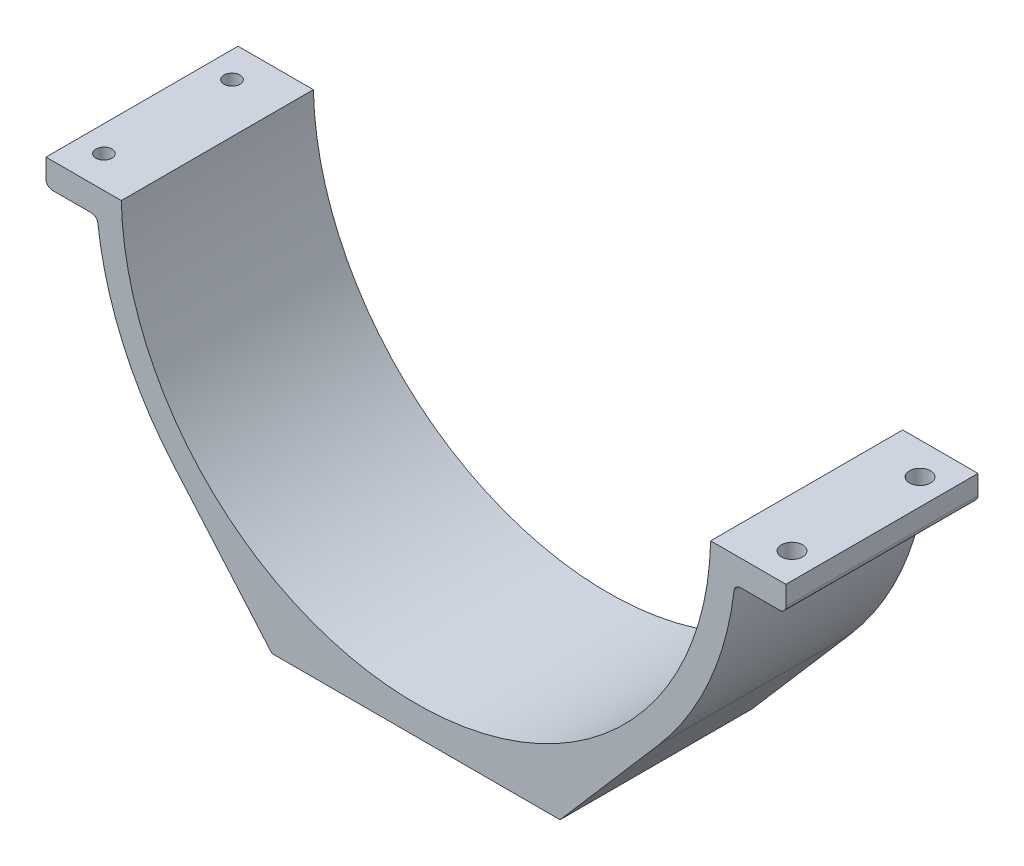
ISO-10303-21;
HEADER;
FILE_DESCRIPTION(('STEP AP214'),'2;1');
FILE_NAME('part.step','',(''),(''),'','','');
FILE_SCHEMA(('AUTOMOTIVE_DESIGN { 1 0 10303 214 1 1 1 1 }'));
ENDSEC;
DATA;
#1=APPLICATION_CONTEXT('core data for automotive mechanical design processes');
#2=APPLICATION_PROTOCOL_DEFINITION('international standard','automotive_design',2000,#1);
#3=PRODUCT_CONTEXT('',#1,'mechanical');
#4=PRODUCT('Part','Part','',(#3));
#5=PRODUCT_RELATED_PRODUCT_CATEGORY('part','',(#4));
#6=PRODUCT_DEFINITION_FORMATION('','',#4);
#7=PRODUCT_DEFINITION_CONTEXT('part definition',#1,'design');
#8=PRODUCT_DEFINITION('design','',#6,#7);
#9=PRODUCT_DEFINITION_SHAPE('','',#8);
#10=(LENGTH_UNIT() NAMED_UNIT(*) SI_UNIT(.MILLI.,.METRE.));
#11=(NAMED_UNIT(*) PLANE_ANGLE_UNIT() SI_UNIT($,.RADIAN.));
#12=(NAMED_UNIT(*) SI_UNIT($,.STERADIAN.) SOLID_ANGLE_UNIT());
#13=UNCERTAINTY_MEASURE_WITH_UNIT(LENGTH_MEASURE(1.E-05),#10,'distance_accuracy_value','');
#14=(GEOMETRIC_REPRESENTATION_CONTEXT(3) GLOBAL_UNCERTAINTY_ASSIGNED_CONTEXT((#13)) GLOBAL_UNIT_ASSIGNED_CONTEXT((#10,
#11,#12)) REPRESENTATION_CONTEXT('',''));
#15=CARTESIAN_POINT('',(0.,0.,0.));
#16=DIRECTION('',(0.,0.,1.));
#17=DIRECTION('',(1.,0.,0.));
#18=AXIS2_PLACEMENT_3D('',#15,#16,#17);
#19=CARTESIAN_POINT('',(-20.,-42.0085799785623,4.99999999999999));
#20=DIRECTION('',(0.,-1.,0.));
#21=DIRECTION('',(0.,0.,-1.));
#22=AXIS2_PLACEMENT_3D('',#19,#20,#21);
#23=CONICAL_SURFACE('',#22,0.,1.02974425867664);
#24=CARTESIAN_POINT('',(-20.,-42.9999999999578,4.99999999999999));
#25=DIRECTION('',(0.,1.,0.));
#26=DIRECTION('',(0.,0.,1.));
#27=AXIS2_PLACEMENT_3D('',#24,#25,#26);
#28=CIRCLE('',#27,1.65);
#29=CARTESIAN_POINT('',(-20.,-42.9999999999578,6.64999999999999));
#30=VERTEX_POINT('',#29);
#31=EDGE_CURVE('E251',#30,#30,#28,.T.);
#32=ORIENTED_EDGE('',*,*,#31,.F.);
#33=EDGE_LOOP('',(#32));
#34=FACE_BOUND('',#33,.T.);
#35=CARTESIAN_POINT('',(-20.,-42.0085799785623,4.99999999999999));
#36=VERTEX_POINT('',#35);
#37=VERTEX_LOOP('',#36);
#38=FACE_BOUND('',#37,.T.);
#39=ADVANCED_FACE('F17',(#34,#38),#23,.F.);
#40=CARTESIAN_POINT('',(20.,-42.0085799785623,4.99999999999999));
#41=DIRECTION('',(0.,-1.,0.));
#42=DIRECTION('',(0.,0.,-1.));
#43=AXIS2_PLACEMENT_3D('',#40,#41,#42);
#44=CONICAL_SURFACE('',#43,0.,1.02974425867664);
#45=CARTESIAN_POINT('',(20.,-42.9999999999578,4.99999999999999));
#46=DIRECTION('',(0.,1.,0.));
#47=DIRECTION('',(0.,0.,1.));
#48=AXIS2_PLACEMENT_3D('',#45,#46,#47);
#49=CIRCLE('',#48,1.65);
#50=CARTESIAN_POINT('',(20.,-42.9999999999578,6.64999999999999));
#51=VERTEX_POINT('',#50);
#52=EDGE_CURVE('E338',#51,#51,#49,.T.);
#53=ORIENTED_EDGE('',*,*,#52,.F.);
#54=EDGE_LOOP('',(#53));
#55=FACE_BOUND('',#54,.T.);
#56=CARTESIAN_POINT('',(20.,-42.0085799785623,4.99999999999999));
#57=VERTEX_POINT('',#56);
#58=VERTEX_LOOP('',#57);
#59=FACE_BOUND('',#58,.T.);
#60=ADVANCED_FACE('F135',(#55,#59),#44,.F.);
#61=CARTESIAN_POINT('',(-20.0000000000051,-42.0085799785623,25.));
#62=DIRECTION('',(0.,-1.,0.));
#63=DIRECTION('',(0.,0.,-1.));
#64=AXIS2_PLACEMENT_3D('',#61,#62,#63);
#65=CONICAL_SURFACE('',#64,0.,1.02974425867666);
#66=CARTESIAN_POINT('',(-20.0000000000051,-42.9999999999578,25.));
#67=DIRECTION('',(0.,1.,0.));
#68=DIRECTION('',(0.,0.,1.));
#69=AXIS2_PLACEMENT_3D('',#66,#67,#68);
#70=CIRCLE('',#69,1.65000000000004);
#71=CARTESIAN_POINT('',(-20.0000000000051,-42.9999999999578,26.65));
#72=VERTEX_POINT('',#71);
#73=EDGE_CURVE('E333',#72,#72,#70,.T.);
#74=ORIENTED_EDGE('',*,*,#73,.F.);
#75=EDGE_LOOP('',(#74));
#76=FACE_BOUND('',#75,.T.);
#77=CARTESIAN_POINT('',(-20.0000000000051,-42.0085799785623,25.));
#78=VERTEX_POINT('',#77);
#79=VERTEX_LOOP('',#78);
#80=FACE_BOUND('',#79,.T.);
#81=ADVANCED_FACE('F142',(#76,#80),#65,.F.);
#82=CARTESIAN_POINT('',(20.0000000000051,-42.0085799785623,25.));
#83=DIRECTION('',(0.,-1.,0.));
#84=DIRECTION('',(0.,0.,-1.));
#85=AXIS2_PLACEMENT_3D('',#82,#83,#84);
#86=CONICAL_SURFACE('',#85,0.,1.02974425867666);
#87=CARTESIAN_POINT('',(20.0000000000051,-42.9999999999578,25.));
#88=DIRECTION('',(0.,1.,0.));
#89=DIRECTION('',(0.,0.,1.));
#90=AXIS2_PLACEMENT_3D('',#87,#88,#89);
#91=CIRCLE('',#90,1.65000000000004);
#92=CARTESIAN_POINT('',(20.0000000000051,-42.9999999999578,26.65));
#93=VERTEX_POINT('',#92);
#94=EDGE_CURVE('E328',#93,#93,#91,.T.);
#95=ORIENTED_EDGE('',*,*,#94,.F.);
#96=EDGE_LOOP('',(#95));
#97=FACE_BOUND('',#96,.T.);
#98=CARTESIAN_POINT('',(20.0000000000051,-42.0085799785623,25.));
#99=VERTEX_POINT('',#98);
#100=VERTEX_LOOP('',#99);
#101=FACE_BOUND('',#100,.T.);
#102=ADVANCED_FACE('F632',(#97,#101),#86,.F.);
#103=CARTESIAN_POINT('',(-56.7870606307502,-4.,0.));
#104=DIRECTION('',(0.,0.,1.));
#105=DIRECTION('',(1.,0.,0.));
#106=AXIS2_PLACEMENT_3D('',#103,#104,#105);
#107=CYLINDRICAL_SURFACE('',#106,1.00000000000003);
#108=CARTESIAN_POINT('',(-56.7870606307502,-4.,29.9999999999999));
#109=DIRECTION('',(0.,0.,1.));
#110=DIRECTION('',(1.,0.,0.));
#111=AXIS2_PLACEMENT_3D('',#108,#109,#110);
#112=CIRCLE('',#111,1.00000000000003);
#113=CARTESIAN_POINT('',(-56.7870606307502,-4.99999999999999,29.9999999999999));
#114=VERTEX_POINT('',#113);
#115=CARTESIAN_POINT('',(-57.7870606307502,-4.,29.9999999999999));
#116=VERTEX_POINT('',#115);
#117=EDGE_CURVE('E253',#114,#116,#112,.F.);
#118=ORIENTED_EDGE('',*,*,#117,.T.);
#119=DIRECTION('',(0.,0.,1.));
#120=VECTOR('',#119,1.);
#121=CARTESIAN_POINT('',(-57.7870606307502,-4.,14.9999999999999));
#122=LINE('',#121,#120);
#123=CARTESIAN_POINT('',(-57.7870606307502,-4.,0.));
#124=VERTEX_POINT('',#123);
#125=EDGE_CURVE('E261',#124,#116,#122,.T.);
#126=ORIENTED_EDGE('',*,*,#125,.F.);
#127=CARTESIAN_POINT('',(-56.7870606307502,-4.,0.));
#128=DIRECTION('',(0.,0.,1.));
#129=DIRECTION('',(1.,0.,0.));
#130=AXIS2_PLACEMENT_3D('',#127,#128,#129);
#131=CIRCLE('',#130,1.00000000000003);
#132=CARTESIAN_POINT('',(-56.7870606307502,-4.99999999999999,0.));
#133=VERTEX_POINT('',#132);
#134=EDGE_CURVE('E21',#124,#133,#131,.T.);
#135=ORIENTED_EDGE('',*,*,#134,.T.);
#136=DIRECTION('',(0.,0.,-1.));
#137=VECTOR('',#136,1.);
#138=CARTESIAN_POINT('',(-56.7870606307502,-4.99999999999999,14.9999999999999));
#139=LINE('',#138,#137);
#140=EDGE_CURVE('E248',#114,#133,#139,.T.);
#141=ORIENTED_EDGE('',*,*,#140,.F.);
#142=EDGE_LOOP('',(#118,#126,#135,#141));
#143=FACE_BOUND('',#142,.T.);
#144=ADVANCED_FACE('F259',(#143),#107,.T.);
#145=CARTESIAN_POINT('',(-50.6835910946532,-6.00000000000004,29.9999999999999));
#146=DIRECTION('',(0.,0.,-1.));
#147=DIRECTION('',(0.,1.,0.));
#148=AXIS2_PLACEMENT_3D('',#145,#146,#147);
#149=CYLINDRICAL_SURFACE('',#148,1.00000000000008);
#150=CARTESIAN_POINT('',(-50.6835910946532,-6.00000000000004,29.9999999999999));
#151=DIRECTION('',(0.,0.,-1.));
#152=DIRECTION('',(0.,1.,0.));
#153=AXIS2_PLACEMENT_3D('',#150,#151,#152);
#154=CIRCLE('',#153,1.00000000000008);
#155=CARTESIAN_POINT('',(-49.6905253862102,-5.88243938280679,29.9999999999999));
#156=VERTEX_POINT('',#155);
#157=CARTESIAN_POINT('',(-50.6835910946532,-4.99999999999999,29.9999999999999));
#158=VERTEX_POINT('',#157);
#159=EDGE_CURVE('E249',#156,#158,#154,.F.);
#160=ORIENTED_EDGE('',*,*,#159,.T.);
#161=DIRECTION('',(0.,0.,1.));
#162=VECTOR('',#161,1.);
#163=CARTESIAN_POINT('',(-50.6835910946532,-4.99999999999999,14.9999999999999));
#164=LINE('',#163,#162);
#165=CARTESIAN_POINT('',(-50.6835910946532,-4.99999999999999,0.));
#166=VERTEX_POINT('',#165);
#167=EDGE_CURVE('E271',#166,#158,#164,.T.);
#168=ORIENTED_EDGE('',*,*,#167,.F.);
#169=CARTESIAN_POINT('',(-50.6835910946533,-6.00000000000017,0.));
#170=DIRECTION('',(0.,0.,-1.));
#171=DIRECTION('',(0.,1.,0.));
#172=AXIS2_PLACEMENT_3D('',#169,#170,#171);
#173=CIRCLE('',#172,1.00000000000008);
#174=CARTESIAN_POINT('',(-49.6905253862103,-5.88243938280685,0.));
#175=VERTEX_POINT('',#174);
#176=EDGE_CURVE('E252',#166,#175,#173,.T.);
#177=ORIENTED_EDGE('',*,*,#176,.T.);
#178=DIRECTION('',(0.,0.,-1.));
#179=VECTOR('',#178,1.);
#180=CARTESIAN_POINT('',(-49.6905253862102,-5.88243938280677,14.9999999999999));
#181=LINE('',#180,#179);
#182=EDGE_CURVE('E244',#156,#175,#181,.T.);
#183=ORIENTED_EDGE('',*,*,#182,.F.);
#184=EDGE_LOOP('',(#160,#168,#177,#183));
#185=FACE_BOUND('',#184,.T.);
#186=ADVANCED_FACE('F351',(#185),#149,.F.);
#187=CARTESIAN_POINT('',(-20.,-42.9999999999578,4.99999999999999));
#188=DIRECTION('',(0.,-1.,0.));
#189=DIRECTION('',(0.,0.,-1.));
#190=AXIS2_PLACEMENT_3D('',#187,#188,#189);
#191=CYLINDRICAL_SURFACE('',#190,1.65);
#192=CARTESIAN_POINT('',(-20.,-50.4999999999578,4.99999999999999));
#193=DIRECTION('',(0.,-1.,0.));
#194=DIRECTION('',(0.,0.,-1.));
#195=AXIS2_PLACEMENT_3D('',#192,#193,#194);
#196=CIRCLE('',#195,1.65);
#197=CARTESIAN_POINT('',(-20.,-50.4999999999578,3.34999999999999));
#198=VERTEX_POINT('',#197);
#199=EDGE_CURVE('E237',#198,#198,#196,.F.);
#200=ORIENTED_EDGE('',*,*,#199,.F.);
#201=EDGE_LOOP('',(#200));
#202=FACE_BOUND('',#201,.T.);
#203=ORIENTED_EDGE('',*,*,#31,.T.);
#204=EDGE_LOOP('',(#203));
#205=FACE_BOUND('',#204,.T.);
#206=ADVANCED_FACE('F348',(#202,#205),#191,.F.);
#207=CARTESIAN_POINT('',(20.,-42.9999999999578,4.99999999999999));
#208=DIRECTION('',(0.,-1.,0.));
#209=DIRECTION('',(0.,0.,-1.));
#210=AXIS2_PLACEMENT_3D('',#207,#208,#209);
#211=CYLINDRICAL_SURFACE('',#210,1.65);
#212=CARTESIAN_POINT('',(20.,-50.4999999999578,4.99999999999999));
#213=DIRECTION('',(0.,-1.,0.));
#214=DIRECTION('',(0.,0.,-1.));
#215=AXIS2_PLACEMENT_3D('',#212,#213,#214);
#216=CIRCLE('',#215,1.65);
#217=CARTESIAN_POINT('',(20.,-50.4999999999578,3.34999999999999));
#218=VERTEX_POINT('',#217);
#219=EDGE_CURVE('E234',#218,#218,#216,.F.);
#220=ORIENTED_EDGE('',*,*,#219,.F.);
#221=EDGE_LOOP('',(#220));
#222=FACE_BOUND('',#221,.T.);
#223=ORIENTED_EDGE('',*,*,#52,.T.);
#224=EDGE_LOOP('',(#223));
#225=FACE_BOUND('',#224,.T.);
#226=ADVANCED_FACE('F350',(#222,#225),#211,.F.);
#227=CARTESIAN_POINT('',(-20.0000000000051,-42.9999999999578,25.));
#228=DIRECTION('',(0.,-1.,0.));
#229=DIRECTION('',(0.,0.,-1.));
#230=AXIS2_PLACEMENT_3D('',#227,#228,#229);
#231=CYLINDRICAL_SURFACE('',#230,1.65000000000004);
#232=CARTESIAN_POINT('',(-20.0000000000051,-50.4999999999578,25.));
#233=DIRECTION('',(0.,-1.,0.));
#234=DIRECTION('',(0.,0.,-1.));
#235=AXIS2_PLACEMENT_3D('',#232,#233,#234);
#236=CIRCLE('',#235,1.65000000000004);
#237=CARTESIAN_POINT('',(-20.0000000000051,-50.4999999999578,23.35));
#238=VERTEX_POINT('',#237);
#239=EDGE_CURVE('E231',#238,#238,#236,.F.);
#240=ORIENTED_EDGE('',*,*,#239,.F.);
#241=EDGE_LOOP('',(#240));
#242=FACE_BOUND('',#241,.T.);
#243=ORIENTED_EDGE('',*,*,#73,.T.);
#244=EDGE_LOOP('',(#243));
#245=FACE_BOUND('',#244,.T.);
#246=ADVANCED_FACE('F358',(#242,#245),#231,.F.);
#247=CARTESIAN_POINT('',(20.0000000000051,-42.9999999999578,25.));
#248=DIRECTION('',(0.,-1.,0.));
#249=DIRECTION('',(0.,0.,-1.));
#250=AXIS2_PLACEMENT_3D('',#247,#248,#249);
#251=CYLINDRICAL_SURFACE('',#250,1.65000000000004);
#252=CARTESIAN_POINT('',(20.0000000000051,-50.4999999999578,25.));
#253=DIRECTION('',(0.,-1.,0.));
#254=DIRECTION('',(0.,0.,-1.));
#255=AXIS2_PLACEMENT_3D('',#252,#253,#254);
#256=CIRCLE('',#255,1.65000000000004);
#257=CARTESIAN_POINT('',(20.0000000000051,-50.4999999999578,23.35));
#258=VERTEX_POINT('',#257);
#259=EDGE_CURVE('E227',#258,#258,#256,.F.);
#260=ORIENTED_EDGE('',*,*,#259,.F.);
#261=EDGE_LOOP('',(#260));
#262=FACE_BOUND('',#261,.T.);
#263=ORIENTED_EDGE('',*,*,#94,.T.);
#264=EDGE_LOOP('',(#263));
#265=FACE_BOUND('',#264,.T.);
#266=ADVANCED_FACE('F368',(#262,#265),#251,.F.);
#267=CARTESIAN_POINT('',(-53.7353258627015,-1.,4.99999999999999));
#268=DIRECTION('',(0.,-1.,0.));
#269=DIRECTION('',(0.,0.,-1.));
#270=AXIS2_PLACEMENT_3D('',#267,#268,#269);
#271=CYLINDRICAL_SURFACE('',#270,1.25000000000004);
#272=CARTESIAN_POINT('',(-53.7353258627015,-4.99999999999999,4.99999999999999));
#273=DIRECTION('',(0.,-1.,0.));
#274=DIRECTION('',(0.,0.,-1.));
#275=AXIS2_PLACEMENT_3D('',#272,#273,#274);
#276=CIRCLE('',#275,1.25000000000004);
#277=CARTESIAN_POINT('',(-53.7353258627015,-4.99999999999999,3.74999999999995));
#278=VERTEX_POINT('',#277);
#279=EDGE_CURVE('E245',#278,#278,#276,.F.);
#280=ORIENTED_EDGE('',*,*,#279,.F.);
#281=EDGE_LOOP('',(#280));
#282=FACE_BOUND('',#281,.T.);
#283=CARTESIAN_POINT('',(-53.7353258627015,-1.,4.99999999999999));
#284=DIRECTION('',(0.,-1.,0.));
#285=DIRECTION('',(0.,0.,-1.));
#286=AXIS2_PLACEMENT_3D('',#283,#284,#285);
#287=CIRCLE('',#286,1.25000000000004);
#288=CARTESIAN_POINT('',(-53.7353258627015,-1.,3.74999999999995));
#289=VERTEX_POINT('',#288);
#290=EDGE_CURVE('E223',#289,#289,#287,.T.);
#291=ORIENTED_EDGE('',*,*,#290,.F.);
#292=EDGE_LOOP('',(#291));
#293=FACE_BOUND('',#292,.T.);
#294=ADVANCED_FACE('F372',(#282,#293),#271,.F.);
#295=CARTESIAN_POINT('',(-53.7353258627015,-1.,25.));
#296=DIRECTION('',(0.,-1.,0.));
#297=DIRECTION('',(0.,0.,-1.));
#298=AXIS2_PLACEMENT_3D('',#295,#296,#297);
#299=CYLINDRICAL_SURFACE('',#298,1.24999999999999);
#300=CARTESIAN_POINT('',(-53.7353258627015,-4.99999999999999,25.));
#301=DIRECTION('',(0.,-1.,0.));
#302=DIRECTION('',(0.,0.,-1.));
#303=AXIS2_PLACEMENT_3D('',#300,#301,#302);
#304=CIRCLE('',#303,1.24999999999999);
#305=CARTESIAN_POINT('',(-53.7353258627015,-4.99999999999999,23.75));
#306=VERTEX_POINT('',#305);
#307=EDGE_CURVE('E241',#306,#306,#304,.F.);
#308=ORIENTED_EDGE('',*,*,#307,.F.);
#309=EDGE_LOOP('',(#308));
#310=FACE_BOUND('',#309,.T.);
#311=CARTESIAN_POINT('',(-53.7353258627015,-1.,25.));
#312=DIRECTION('',(0.,-1.,0.));
#313=DIRECTION('',(0.,0.,-1.));
#314=AXIS2_PLACEMENT_3D('',#311,#312,#313);
#315=CIRCLE('',#314,1.24999999999999);
#316=CARTESIAN_POINT('',(-53.7353258627015,-1.,23.75));
#317=VERTEX_POINT('',#316);
#318=EDGE_CURVE('E219',#317,#317,#315,.T.);
#319=ORIENTED_EDGE('',*,*,#318,.F.);
#320=EDGE_LOOP('',(#319));
#321=FACE_BOUND('',#320,.T.);
#322=ADVANCED_FACE('F376',(#310,#321),#299,.F.);
#323=CARTESIAN_POINT('',(-57.7870606307502,-0.999,-0.00100000000000211));
#324=DIRECTION('',(-1.,0.,0.));
#325=DIRECTION('',(0.,-1.,0.));
#326=AXIS2_PLACEMENT_3D('',#323,#324,#325);
#327=PLANE('',#326);
#328=DIRECTION('',(0.,-1.,0.));
#329=VECTOR('',#328,1.);
#330=CARTESIAN_POINT('',(-57.7870606307502,-25.7499999999789,29.9999999999999));
#331=LINE('',#330,#329);
#332=CARTESIAN_POINT('',(-57.7870606307502,-1.,29.9999999999999));
#333=VERTEX_POINT('',#332);
#334=EDGE_CURVE('E316',#333,#116,#331,.T.);
#335=ORIENTED_EDGE('',*,*,#334,.F.);
#336=DIRECTION('',(0.,0.,1.));
#337=VECTOR('',#336,1.);
#338=CARTESIAN_POINT('',(-57.7870606307502,-1.,14.9999999999999));
#339=LINE('',#338,#337);
#340=CARTESIAN_POINT('',(-57.7870606307502,-1.,0.));
#341=VERTEX_POINT('',#340);
#342=EDGE_CURVE('E226',#341,#333,#339,.T.);
#343=ORIENTED_EDGE('',*,*,#342,.F.);
#344=DIRECTION('',(0.,1.,0.));
#345=VECTOR('',#344,1.);
#346=CARTESIAN_POINT('',(-57.7870606307502,-25.7499999999789,0.));
#347=LINE('',#346,#345);
#348=EDGE_CURVE('E284',#124,#341,#347,.T.);
#349=ORIENTED_EDGE('',*,*,#348,.F.);
#350=ORIENTED_EDGE('',*,*,#125,.T.);
#351=EDGE_LOOP('',(#335,#343,#349,#350));
#352=FACE_BOUND('',#351,.T.);
#353=ADVANCED_FACE('F380',(#352),#327,.T.);
#354=CARTESIAN_POINT('',(-56.7880606307501,-4.99999999999999,30.0009999999999));
#355=DIRECTION('',(0.,-1.,0.));
#356=DIRECTION('',(0.,0.,-1.));
#357=AXIS2_PLACEMENT_3D('',#354,#355,#356);
#358=PLANE('',#357);
#359=ORIENTED_EDGE('',*,*,#307,.T.);
#360=EDGE_LOOP('',(#359));
#361=FACE_BOUND('',#360,.T.);
#362=ORIENTED_EDGE('',*,*,#279,.T.);
#363=EDGE_LOOP('',(#362));
#364=FACE_BOUND('',#363,.T.);
#365=DIRECTION('',(1.,0.,0.));
#366=VECTOR('',#365,1.);
#367=CARTESIAN_POINT('',(0.,-4.99999999999999,29.9999999999999));
#368=LINE('',#367,#366);
#369=EDGE_CURVE('E196',#114,#158,#368,.T.);
#370=ORIENTED_EDGE('',*,*,#369,.F.);
#371=ORIENTED_EDGE('',*,*,#140,.T.);
#372=DIRECTION('',(-1.,0.,0.));
#373=VECTOR('',#372,1.);
#374=CARTESIAN_POINT('',(0.,-4.99999999999999,0.));
#375=LINE('',#374,#373);
#376=EDGE_CURVE('E201',#166,#133,#375,.T.);
#377=ORIENTED_EDGE('',*,*,#376,.F.);
#378=ORIENTED_EDGE('',*,*,#167,.T.);
#379=EDGE_LOOP('',(#370,#371,#377,#378));
#380=FACE_BOUND('',#379,.T.);
#381=ADVANCED_FACE('F268',(#361,#364,#380),#358,.T.);
#382=CARTESIAN_POINT('',(0.,-3.62557206479153E-13,0.));
#383=DIRECTION('',(0.,0.,1.));
#384=DIRECTION('',(1.,0.,0.));
#385=AXIS2_PLACEMENT_3D('',#382,#383,#384);
#386=CYLINDRICAL_SURFACE('',#385,50.0374999999999);
#387=CARTESIAN_POINT('',(0.,-3.62557206479153E-13,29.9999999999999));
#388=DIRECTION('',(0.,0.,1.));
#389=DIRECTION('',(1.,0.,0.));
#390=AXIS2_PLACEMENT_3D('',#387,#388,#389);
#391=CIRCLE('',#390,50.0374999999999);
#392=CARTESIAN_POINT('',(-37.867891366269,-32.7074029804026,29.9999999999999));
#393=VERTEX_POINT('',#392);
#394=EDGE_CURVE('E193',#156,#393,#391,.T.);
#395=ORIENTED_EDGE('',*,*,#394,.F.);
#396=ORIENTED_EDGE('',*,*,#182,.T.);
#397=CARTESIAN_POINT('',(0.,-3.62557206479153E-13,0.));
#398=DIRECTION('',(0.,0.,1.));
#399=DIRECTION('',(1.,0.,0.));
#400=AXIS2_PLACEMENT_3D('',#397,#398,#399);
#401=CIRCLE('',#400,50.0374999999999);
#402=CARTESIAN_POINT('',(-37.867891366269,-32.7074029804026,0.));
#403=VERTEX_POINT('',#402);
#404=EDGE_CURVE('E202',#403,#175,#401,.F.);
#405=ORIENTED_EDGE('',*,*,#404,.F.);
#406=DIRECTION('',(0.,0.,-1.));
#407=VECTOR('',#406,1.);
#408=CARTESIAN_POINT('',(-37.867891366269,-32.7074029804026,14.9999999999999));
#409=LINE('',#408,#407);
#410=EDGE_CURVE('E322',#393,#403,#409,.T.);
#411=ORIENTED_EDGE('',*,*,#410,.F.);
#412=EDGE_LOOP('',(#395,#396,#405,#411));
#413=FACE_BOUND('',#412,.T.);
#414=ADVANCED_FACE('F387',(#413),#386,.T.);
#415=CARTESIAN_POINT('',(-37.8685450240854,-32.7066461901678,-0.00100000000001543));
#416=DIRECTION('',(-0.756790234649395,-0.653657816245866,0.));
#417=DIRECTION('',(0.653657816245866,-0.756790234649395,0.));
#418=AXIS2_PLACEMENT_3D('',#415,#416,#417);
#419=PLANE('',#418);
#420=DIRECTION('',(0.653657816245864,-0.756790234649396,0.));
#421=VECTOR('',#420,1.);
#422=CARTESIAN_POINT('',(-37.867891366269,-32.7074029804026,29.9999999999999));
#423=LINE('',#422,#421);
#424=CARTESIAN_POINT('',(-22.5,-50.4999999999578,29.9999999999999));
#425=VERTEX_POINT('',#424);
#426=EDGE_CURVE('E190',#393,#425,#423,.T.);
#427=ORIENTED_EDGE('',*,*,#426,.F.);
#428=ORIENTED_EDGE('',*,*,#410,.T.);
#429=DIRECTION('',(-0.653657816245865,0.756790234649396,0.));
#430=VECTOR('',#429,1.);
#431=CARTESIAN_POINT('',(-22.5,-50.4999999999578,0.));
#432=LINE('',#431,#430);
#433=CARTESIAN_POINT('',(-22.5,-50.4999999999578,0.));
#434=VERTEX_POINT('',#433);
#435=EDGE_CURVE('E205',#434,#403,#432,.T.);
#436=ORIENTED_EDGE('',*,*,#435,.F.);
#437=DIRECTION('',(0.,0.,-1.));
#438=VECTOR('',#437,1.);
#439=CARTESIAN_POINT('',(-22.5,-50.4999999999578,14.9999999999999));
#440=LINE('',#439,#438);
#441=EDGE_CURVE('E240',#425,#434,#440,.T.);
#442=ORIENTED_EDGE('',*,*,#441,.F.);
#443=EDGE_LOOP('',(#427,#428,#436,#442));
#444=FACE_BOUND('',#443,.T.);
#445=ADVANCED_FACE('F391',(#444),#419,.T.);
#446=CARTESIAN_POINT('',(-22.501,-50.4999999999578,-0.00100000000000211));
#447=DIRECTION('',(0.,-1.,0.));
#448=DIRECTION('',(1.,0.,0.));
#449=AXIS2_PLACEMENT_3D('',#446,#447,#448);
#450=PLANE('',#449);
#451=ORIENTED_EDGE('',*,*,#259,.T.);
#452=EDGE_LOOP('',(#451));
#453=FACE_BOUND('',#452,.T.);
#454=ORIENTED_EDGE('',*,*,#239,.T.);
#455=EDGE_LOOP('',(#454));
#456=FACE_BOUND('',#455,.T.);
#457=ORIENTED_EDGE('',*,*,#219,.T.);
#458=EDGE_LOOP('',(#457));
#459=FACE_BOUND('',#458,.T.);
#460=ORIENTED_EDGE('',*,*,#199,.T.);
#461=EDGE_LOOP('',(#460));
#462=FACE_BOUND('',#461,.T.);
#463=DIRECTION('',(1.,0.,0.));
#464=VECTOR('',#463,1.);
#465=CARTESIAN_POINT('',(0.,-50.4999999999578,29.9999999999999));
#466=LINE('',#465,#464);
#467=CARTESIAN_POINT('',(22.5,-50.4999999999578,29.9999999999999));
#468=VERTEX_POINT('',#467);
#469=EDGE_CURVE('E189',#425,#468,#466,.T.);
#470=ORIENTED_EDGE('',*,*,#469,.F.);
#471=ORIENTED_EDGE('',*,*,#441,.T.);
#472=DIRECTION('',(-1.,0.,0.));
#473=VECTOR('',#472,1.);
#474=CARTESIAN_POINT('',(0.,-50.4999999999578,0.));
#475=LINE('',#474,#473);
#476=CARTESIAN_POINT('',(22.5,-50.4999999999578,0.));
#477=VERTEX_POINT('',#476);
#478=EDGE_CURVE('E208',#477,#434,#475,.T.);
#479=ORIENTED_EDGE('',*,*,#478,.F.);
#480=DIRECTION('',(0.,0.,-1.));
#481=VECTOR('',#480,1.);
#482=CARTESIAN_POINT('',(22.5,-50.4999999999578,14.9999999999999));
#483=LINE('',#482,#481);
#484=EDGE_CURVE('E230',#468,#477,#483,.T.);
#485=ORIENTED_EDGE('',*,*,#484,.F.);
#486=EDGE_LOOP('',(#470,#471,#479,#485));
#487=FACE_BOUND('',#486,.T.);
#488=ADVANCED_FACE('F395',(#453,#456,#459,#462,#487),#450,.T.);
#489=CARTESIAN_POINT('',(22.4993463421838,-50.5007567901925,-0.00100000000001543));
#490=DIRECTION('',(0.756790234649395,-0.653657816245865,0.));
#491=DIRECTION('',(0.653657816245865,0.756790234649395,0.));
#492=AXIS2_PLACEMENT_3D('',#489,#490,#491);
#493=PLANE('',#492);
#494=DIRECTION('',(0.653657816245864,0.756790234649396,0.));
#495=VECTOR('',#494,1.);
#496=CARTESIAN_POINT('',(22.5,-50.4999999999578,29.9999999999999));
#497=LINE('',#496,#495);
#498=CARTESIAN_POINT('',(37.8678913662691,-32.7074029804024,29.9999999999999));
#499=VERTEX_POINT('',#498);
#500=EDGE_CURVE('E186',#468,#499,#497,.T.);
#501=ORIENTED_EDGE('',*,*,#500,.F.);
#502=ORIENTED_EDGE('',*,*,#484,.T.);
#503=DIRECTION('',(-0.653657816245864,-0.756790234649396,0.));
#504=VECTOR('',#503,1.);
#505=CARTESIAN_POINT('',(37.867891366269,-32.7074029804026,0.));
#506=LINE('',#505,#504);
#507=CARTESIAN_POINT('',(37.8678913662691,-32.7074029804024,0.));
#508=VERTEX_POINT('',#507);
#509=EDGE_CURVE('E209',#508,#477,#506,.T.);
#510=ORIENTED_EDGE('',*,*,#509,.F.);
#511=DIRECTION('',(0.,0.,-1.));
#512=VECTOR('',#511,1.);
#513=CARTESIAN_POINT('',(37.867891366269,-32.7074029804026,14.9999999999999));
#514=LINE('',#513,#512);
#515=EDGE_CURVE('E222',#499,#508,#514,.T.);
#516=ORIENTED_EDGE('',*,*,#515,.F.);
#517=EDGE_LOOP('',(#501,#502,#510,#516));
#518=FACE_BOUND('',#517,.T.);
#519=ADVANCED_FACE('F399',(#518),#493,.T.);
#520=CARTESIAN_POINT('',(-57.7880606307502,-1.,-0.00100000000000211));
#521=DIRECTION('',(0.,1.,0.));
#522=DIRECTION('',(0.,0.,1.));
#523=AXIS2_PLACEMENT_3D('',#520,#521,#522);
#524=PLANE('',#523);
#525=ORIENTED_EDGE('',*,*,#318,.T.);
#526=EDGE_LOOP('',(#525));
#527=FACE_BOUND('',#526,.T.);
#528=ORIENTED_EDGE('',*,*,#290,.T.);
#529=EDGE_LOOP('',(#528));
#530=FACE_BOUND('',#529,.T.);
#531=DIRECTION('',(-1.,0.,0.));
#532=VECTOR('',#531,1.);
#533=CARTESIAN_POINT('',(0.,-1.,29.9999999999999));
#534=LINE('',#533,#532);
#535=CARTESIAN_POINT('',(-46.0266380072453,-0.999999999999996,29.9999999999999));
#536=VERTEX_POINT('',#535);
#537=EDGE_CURVE('E176',#536,#333,#534,.T.);
#538=ORIENTED_EDGE('',*,*,#537,.F.);
#539=DIRECTION('',(0.,0.,1.));
#540=VECTOR('',#539,1.);
#541=CARTESIAN_POINT('',(-46.0266380072452,-0.999999999999991,14.9999999999999));
#542=LINE('',#541,#540);
#543=CARTESIAN_POINT('',(-46.0266380072453,-0.999999999999996,0.));
#544=VERTEX_POINT('',#543);
#545=EDGE_CURVE('E288',#544,#536,#542,.T.);
#546=ORIENTED_EDGE('',*,*,#545,.F.);
#547=DIRECTION('',(1.,0.,0.));
#548=VECTOR('',#547,1.);
#549=CARTESIAN_POINT('',(0.,-1.,0.));
#550=LINE('',#549,#548);
#551=EDGE_CURVE('E218',#341,#544,#550,.T.);
#552=ORIENTED_EDGE('',*,*,#551,.F.);
#553=ORIENTED_EDGE('',*,*,#342,.T.);
#554=EDGE_LOOP('',(#538,#546,#552,#553));
#555=FACE_BOUND('',#554,.T.);
#556=ADVANCED_FACE('F403',(#527,#530,#555),#524,.T.);
#557=CARTESIAN_POINT('',(7.8756445809347E-13,-4.3758399681515E-13,0.));
#558=DIRECTION('',(0.,0.,1.));
#559=DIRECTION('',(1.,0.,0.));
#560=AXIS2_PLACEMENT_3D('',#557,#558,#559);
#561=CYLINDRICAL_SURFACE('',#560,50.0374999999991);
#562=CARTESIAN_POINT('',(7.8756445809347E-13,-4.3758399681515E-13,29.9999999999999));
#563=DIRECTION('',(0.,0.,1.));
#564=DIRECTION('',(1.,0.,0.));
#565=AXIS2_PLACEMENT_3D('',#562,#563,#564);
#566=CIRCLE('',#565,50.0374999999991);
#567=CARTESIAN_POINT('',(49.6905253862102,-5.88243938280678,29.9999999999999));
#568=VERTEX_POINT('',#567);
#569=EDGE_CURVE('E184',#499,#568,#566,.T.);
#570=ORIENTED_EDGE('',*,*,#569,.F.);
#571=ORIENTED_EDGE('',*,*,#515,.T.);
#572=CARTESIAN_POINT('',(7.8756445809347E-13,-4.3758399681515E-13,0.));
#573=DIRECTION('',(0.,0.,1.));
#574=DIRECTION('',(1.,0.,0.));
#575=AXIS2_PLACEMENT_3D('',#572,#573,#574);
#576=CIRCLE('',#575,50.0374999999991);
#577=CARTESIAN_POINT('',(49.6905253862102,-5.88243938280684,0.));
#578=VERTEX_POINT('',#577);
#579=EDGE_CURVE('E212',#578,#508,#576,.F.);
#580=ORIENTED_EDGE('',*,*,#579,.F.);
#581=DIRECTION('',(0.,0.,-1.));
#582=VECTOR('',#581,1.);
#583=CARTESIAN_POINT('',(49.6905253862102,-5.88243938280677,14.9999999999999));
#584=LINE('',#583,#582);
#585=EDGE_CURVE('E172',#568,#578,#584,.T.);
#586=ORIENTED_EDGE('',*,*,#585,.F.);
#587=EDGE_LOOP('',(#570,#571,#580,#586));
#588=FACE_BOUND('',#587,.T.);
#589=ADVANCED_FACE('F407',(#588),#561,.T.);
#590=CARTESIAN_POINT('',(0.,0.,29.9999999999999));
#591=DIRECTION('',(0.,0.,-1.));
#592=DIRECTION('',(-1.,0.,0.));
#593=AXIS2_PLACEMENT_3D('',#590,#591,#592);
#594=CYLINDRICAL_SURFACE('',#593,46.0374999999999);
#595=CARTESIAN_POINT('',(0.,0.,29.9999999999999));
#596=DIRECTION('',(0.,0.,-1.));
#597=DIRECTION('',(-1.,0.,0.));
#598=AXIS2_PLACEMENT_3D('',#595,#596,#597);
#599=CIRCLE('',#598,46.0374999999999);
#600=CARTESIAN_POINT('',(46.0266380072452,-0.999999999999988,29.9999999999999));
#601=VERTEX_POINT('',#600);
#602=EDGE_CURVE('E177',#601,#536,#599,.T.);
#603=ORIENTED_EDGE('',*,*,#602,.F.);
#604=DIRECTION('',(0.,0.,1.));
#605=VECTOR('',#604,1.);
#606=CARTESIAN_POINT('',(46.0266380072452,-0.999999999999988,14.9999999999999));
#607=LINE('',#606,#605);
#608=CARTESIAN_POINT('',(46.0266380072452,-0.999999999999988,0.));
#609=VERTEX_POINT('',#608);
#610=EDGE_CURVE('E291',#609,#601,#607,.T.);
#611=ORIENTED_EDGE('',*,*,#610,.F.);
#612=CARTESIAN_POINT('',(0.,0.,0.));
#613=DIRECTION('',(0.,0.,-1.));
#614=DIRECTION('',(-1.,0.,0.));
#615=AXIS2_PLACEMENT_3D('',#612,#613,#614);
#616=CIRCLE('',#615,46.0374999999999);
#617=EDGE_CURVE('E216',#544,#609,#616,.F.);
#618=ORIENTED_EDGE('',*,*,#617,.F.);
#619=ORIENTED_EDGE('',*,*,#545,.T.);
#620=EDGE_LOOP('',(#603,#611,#618,#619));
#621=FACE_BOUND('',#620,.T.);
#622=ADVANCED_FACE('F411',(#621),#594,.F.);
#623=CARTESIAN_POINT('',(57.7870606307502,-4.001,-0.00100000000000211));
#624=DIRECTION('',(1.,0.,0.));
#625=DIRECTION('',(0.,1.,0.));
#626=AXIS2_PLACEMENT_3D('',#623,#624,#625);
#627=PLANE('',#626);
#628=DIRECTION('',(0.,1.,0.));
#629=VECTOR('',#628,1.);
#630=CARTESIAN_POINT('',(57.7870606307502,-25.7499999999789,29.9999999999999));
#631=LINE('',#630,#629);
#632=CARTESIAN_POINT('',(57.7870606307502,-3.99999999999998,29.9999999999999));
#633=VERTEX_POINT('',#632);
#634=CARTESIAN_POINT('',(57.7870606307502,-0.999999999999985,29.9999999999999));
#635=VERTEX_POINT('',#634);
#636=EDGE_CURVE('E180',#633,#635,#631,.T.);
#637=ORIENTED_EDGE('',*,*,#636,.F.);
#638=DIRECTION('',(0.,0.,1.));
#639=VECTOR('',#638,1.);
#640=CARTESIAN_POINT('',(57.7870606307502,-3.99999999999998,14.9999999999999));
#641=LINE('',#640,#639);
#642=CARTESIAN_POINT('',(57.7870606307502,-3.99999999999998,0.));
#643=VERTEX_POINT('',#642);
#644=EDGE_CURVE('E200',#643,#633,#641,.T.);
#645=ORIENTED_EDGE('',*,*,#644,.F.);
#646=DIRECTION('',(0.,-1.,0.));
#647=VECTOR('',#646,1.);
#648=CARTESIAN_POINT('',(57.7870606307502,-25.7499999999789,0.));
#649=LINE('',#648,#647);
#650=CARTESIAN_POINT('',(57.7870606307502,-0.999999999999989,0.));
#651=VERTEX_POINT('',#650);
#652=EDGE_CURVE('E215',#651,#643,#649,.T.);
#653=ORIENTED_EDGE('',*,*,#652,.F.);
#654=DIRECTION('',(0.,0.,-1.));
#655=VECTOR('',#654,1.);
#656=CARTESIAN_POINT('',(57.7870606307502,-0.999999999999986,14.9999999999999));
#657=LINE('',#656,#655);
#658=EDGE_CURVE('E170',#635,#651,#657,.T.);
#659=ORIENTED_EDGE('',*,*,#658,.F.);
#660=EDGE_LOOP('',(#637,#645,#653,#659));
#661=FACE_BOUND('',#660,.T.);
#662=ADVANCED_FACE('F415',(#661),#627,.T.);
#663=CARTESIAN_POINT('',(57.7880606307502,-50.5009999999578,0.));
#664=DIRECTION('',(0.,0.,-1.));
#665=DIRECTION('',(-1.,0.,0.));
#666=AXIS2_PLACEMENT_3D('',#663,#664,#665);
#667=PLANE('',#666);
#668=ORIENTED_EDGE('',*,*,#376,.T.);
#669=ORIENTED_EDGE('',*,*,#134,.F.);
#670=ORIENTED_EDGE('',*,*,#348,.T.);
#671=ORIENTED_EDGE('',*,*,#551,.T.);
#672=ORIENTED_EDGE('',*,*,#617,.T.);
#673=DIRECTION('',(-1.,0.,0.));
#674=VECTOR('',#673,1.);
#675=CARTESIAN_POINT('',(51.9068493189977,-0.999999999999987,0.));
#676=LINE('',#675,#674);
#677=EDGE_CURVE('E295',#651,#609,#676,.T.);
#678=ORIENTED_EDGE('',*,*,#677,.F.);
#679=ORIENTED_EDGE('',*,*,#652,.T.);
#680=CARTESIAN_POINT('',(56.7870606307502,-3.99999999999998,0.));
#681=DIRECTION('',(0.,0.,1.));
#682=DIRECTION('',(1.,0.,0.));
#683=AXIS2_PLACEMENT_3D('',#680,#681,#682);
#684=CIRCLE('',#683,1.00000000000003);
#685=CARTESIAN_POINT('',(56.7870606307502,-4.99999999999999,0.));
#686=VERTEX_POINT('',#685);
#687=EDGE_CURVE('E197',#686,#643,#684,.T.);
#688=ORIENTED_EDGE('',*,*,#687,.F.);
#689=DIRECTION('',(1.,0.,0.));
#690=VECTOR('',#689,1.);
#691=CARTESIAN_POINT('',(53.7353258627017,-4.99999999999999,0.));
#692=LINE('',#691,#690);
#693=CARTESIAN_POINT('',(50.6835910946532,-4.99999999999999,0.));
#694=VERTEX_POINT('',#693);
#695=EDGE_CURVE('E169',#694,#686,#692,.T.);
#696=ORIENTED_EDGE('',*,*,#695,.F.);
#697=CARTESIAN_POINT('',(50.6835910946533,-6.00000000000017,0.));
#698=DIRECTION('',(0.,0.,-1.));
#699=DIRECTION('',(0.,1.,0.));
#700=AXIS2_PLACEMENT_3D('',#697,#698,#699);
#701=CIRCLE('',#700,1.00000000000008);
#702=EDGE_CURVE('E173',#578,#694,#701,.T.);
#703=ORIENTED_EDGE('',*,*,#702,.F.);
#704=ORIENTED_EDGE('',*,*,#579,.T.);
#705=ORIENTED_EDGE('',*,*,#509,.T.);
#706=ORIENTED_EDGE('',*,*,#478,.T.);
#707=ORIENTED_EDGE('',*,*,#435,.T.);
#708=ORIENTED_EDGE('',*,*,#404,.T.);
#709=ORIENTED_EDGE('',*,*,#176,.F.);
#710=EDGE_LOOP('',(#668,#669,#670,#671,#672,#678,#679,#688,#696,#703,#704,#705,#706,#707,#708,#709));
#711=FACE_BOUND('',#710,.T.);
#712=ADVANCED_FACE('F273',(#711),#667,.T.);
#713=CARTESIAN_POINT('',(56.7870606307502,-3.99999999999998,0.));
#714=DIRECTION('',(0.,0.,1.));
#715=DIRECTION('',(1.,0.,0.));
#716=AXIS2_PLACEMENT_3D('',#713,#714,#715);
#717=CYLINDRICAL_SURFACE('',#716,1.00000000000003);
#718=CARTESIAN_POINT('',(56.7870606307502,-3.99999999999998,29.9999999999999));
#719=DIRECTION('',(0.,0.,1.));
#720=DIRECTION('',(1.,0.,0.));
#721=AXIS2_PLACEMENT_3D('',#718,#719,#720);
#722=CIRCLE('',#721,1.00000000000003);
#723=CARTESIAN_POINT('',(56.7870606307502,-4.99999999999999,29.9999999999999));
#724=VERTEX_POINT('',#723);
#725=EDGE_CURVE('E181',#724,#633,#722,.T.);
#726=ORIENTED_EDGE('',*,*,#725,.F.);
#727=DIRECTION('',(0.,0.,1.));
#728=VECTOR('',#727,1.);
#729=CARTESIAN_POINT('',(56.7870606307502,-4.99999999999999,14.9999999999999));
#730=LINE('',#729,#728);
#731=EDGE_CURVE('E471',#686,#724,#730,.T.);
#732=ORIENTED_EDGE('',*,*,#731,.F.);
#733=ORIENTED_EDGE('',*,*,#687,.T.);
#734=ORIENTED_EDGE('',*,*,#644,.T.);
#735=EDGE_LOOP('',(#726,#732,#733,#734));
#736=FACE_BOUND('',#735,.T.);
#737=ADVANCED_FACE('F422',(#736),#717,.T.);
#738=CARTESIAN_POINT('',(-57.7880606307502,-50.5009999999578,29.9999999999999));
#739=DIRECTION('',(0.,0.,1.));
#740=DIRECTION('',(1.,0.,0.));
#741=AXIS2_PLACEMENT_3D('',#738,#739,#740);
#742=PLANE('',#741);
#743=ORIENTED_EDGE('',*,*,#602,.T.);
#744=ORIENTED_EDGE('',*,*,#537,.T.);
#745=ORIENTED_EDGE('',*,*,#334,.T.);
#746=ORIENTED_EDGE('',*,*,#117,.F.);
#747=ORIENTED_EDGE('',*,*,#369,.T.);
#748=ORIENTED_EDGE('',*,*,#159,.F.);
#749=ORIENTED_EDGE('',*,*,#394,.T.);
#750=ORIENTED_EDGE('',*,*,#426,.T.);
#751=ORIENTED_EDGE('',*,*,#469,.T.);
#752=ORIENTED_EDGE('',*,*,#500,.T.);
#753=ORIENTED_EDGE('',*,*,#569,.T.);
#754=CARTESIAN_POINT('',(50.6835910946532,-6.00000000000004,29.9999999999999));
#755=DIRECTION('',(0.,0.,-1.));
#756=DIRECTION('',(0.,1.,0.));
#757=AXIS2_PLACEMENT_3D('',#754,#755,#756);
#758=CIRCLE('',#757,1.00000000000008);
#759=CARTESIAN_POINT('',(50.6835910946532,-4.99999999999999,29.9999999999999));
#760=VERTEX_POINT('',#759);
#761=EDGE_CURVE('E36',#760,#568,#758,.F.);
#762=ORIENTED_EDGE('',*,*,#761,.F.);
#763=DIRECTION('',(-1.,0.,0.));
#764=VECTOR('',#763,1.);
#765=CARTESIAN_POINT('',(53.7353258627017,-4.99999999999999,29.9999999999999));
#766=LINE('',#765,#764);
#767=EDGE_CURVE('E474',#724,#760,#766,.T.);
#768=ORIENTED_EDGE('',*,*,#767,.F.);
#769=ORIENTED_EDGE('',*,*,#725,.T.);
#770=ORIENTED_EDGE('',*,*,#636,.T.);
#771=DIRECTION('',(1.,0.,0.));
#772=VECTOR('',#771,1.);
#773=CARTESIAN_POINT('',(51.9068493189977,-0.999999999999987,29.9999999999999));
#774=LINE('',#773,#772);
#775=EDGE_CURVE('E294',#601,#635,#774,.T.);
#776=ORIENTED_EDGE('',*,*,#775,.F.);
#777=EDGE_LOOP('',(#743,#744,#745,#746,#747,#748,#749,#750,#751,#752,#753,#762,#768,#769,#770,#776));
#778=FACE_BOUND('',#777,.T.);
#779=ADVANCED_FACE('F425',(#778),#742,.T.);
#780=CARTESIAN_POINT('',(50.6835910946532,-6.00000000000004,29.9999999999999));
#781=DIRECTION('',(0.,0.,-1.));
#782=DIRECTION('',(0.,1.,0.));
#783=AXIS2_PLACEMENT_3D('',#780,#781,#782);
#784=CYLINDRICAL_SURFACE('',#783,1.00000000000008);
#785=ORIENTED_EDGE('',*,*,#761,.T.);
#786=ORIENTED_EDGE('',*,*,#585,.T.);
#787=ORIENTED_EDGE('',*,*,#702,.T.);
#788=DIRECTION('',(0.,0.,-1.));
#789=VECTOR('',#788,1.);
#790=CARTESIAN_POINT('',(50.6835910946532,-4.99999999999999,14.9999999999999));
#791=LINE('',#790,#789);
#792=EDGE_CURVE('E162',#760,#694,#791,.T.);
#793=ORIENTED_EDGE('',*,*,#792,.F.);
#794=EDGE_LOOP('',(#785,#786,#787,#793));
#795=FACE_BOUND('',#794,.T.);
#796=ADVANCED_FACE('F429',(#795),#784,.F.);
#797=CARTESIAN_POINT('',(53.7353258627036,-0.999999999999981,25.));
#798=DIRECTION('',(0.,-1.,0.));
#799=DIRECTION('',(0.,0.,-1.));
#800=AXIS2_PLACEMENT_3D('',#797,#798,#799);
#801=CYLINDRICAL_SURFACE('',#800,1.65000000000004);
#802=CARTESIAN_POINT('',(53.7353258627036,-4.99999999999999,25.));
#803=DIRECTION('',(0.,-1.,0.));
#804=DIRECTION('',(0.,0.,-1.));
#805=AXIS2_PLACEMENT_3D('',#802,#803,#804);
#806=CIRCLE('',#805,1.65000000000004);
#807=CARTESIAN_POINT('',(53.7353258627036,-4.99999999999999,23.35));
#808=VERTEX_POINT('',#807);
#809=EDGE_CURVE('E159',#808,#808,#806,.F.);
#810=ORIENTED_EDGE('',*,*,#809,.F.);
#811=EDGE_LOOP('',(#810));
#812=FACE_BOUND('',#811,.T.);
#813=CARTESIAN_POINT('',(53.7353258627036,-0.999999999999987,25.));
#814=DIRECTION('',(0.,-1.,0.));
#815=DIRECTION('',(0.,0.,-1.));
#816=AXIS2_PLACEMENT_3D('',#813,#814,#815);
#817=CIRCLE('',#816,1.65000000000004);
#818=CARTESIAN_POINT('',(53.7353258627036,-0.999999999999987,23.35));
#819=VERTEX_POINT('',#818);
#820=EDGE_CURVE('E166',#819,#819,#817,.T.);
#821=ORIENTED_EDGE('',*,*,#820,.F.);
#822=EDGE_LOOP('',(#821));
#823=FACE_BOUND('',#822,.T.);
#824=ADVANCED_FACE('F432',(#812,#823),#801,.F.);
#825=CARTESIAN_POINT('',(57.7880606307502,-0.999999999999986,-0.00100000000000211));
#826=DIRECTION('',(0.,1.,0.));
#827=DIRECTION('',(-1.,0.,0.));
#828=AXIS2_PLACEMENT_3D('',#825,#826,#827);
#829=PLANE('',#828);
#830=ORIENTED_EDGE('',*,*,#820,.T.);
#831=EDGE_LOOP('',(#830));
#832=FACE_BOUND('',#831,.T.);
#833=CARTESIAN_POINT('',(53.7353258627036,-0.999999999999987,4.99999999999999));
#834=DIRECTION('',(0.,-1.,0.));
#835=DIRECTION('',(0.,0.,-1.));
#836=AXIS2_PLACEMENT_3D('',#833,#834,#835);
#837=CIRCLE('',#836,1.65000000000001);
#838=CARTESIAN_POINT('',(53.7353258627036,-0.999999999999987,3.34999999999998));
#839=VERTEX_POINT('',#838);
#840=EDGE_CURVE('E27',#839,#839,#837,.F.);
#841=ORIENTED_EDGE('',*,*,#840,.F.);
#842=EDGE_LOOP('',(#841));
#843=FACE_BOUND('',#842,.T.);
#844=ORIENTED_EDGE('',*,*,#775,.T.);
#845=ORIENTED_EDGE('',*,*,#658,.T.);
#846=ORIENTED_EDGE('',*,*,#677,.T.);
#847=ORIENTED_EDGE('',*,*,#610,.T.);
#848=EDGE_LOOP('',(#844,#845,#846,#847));
#849=FACE_BOUND('',#848,.T.);
#850=ADVANCED_FACE('F152',(#832,#843,#849),#829,.T.);
#851=CARTESIAN_POINT('',(50.6825910946532,-4.99999999999999,-0.00100000000000211));
#852=DIRECTION('',(0.,-1.,0.));
#853=DIRECTION('',(1.,0.,0.));
#854=AXIS2_PLACEMENT_3D('',#851,#852,#853);
#855=PLANE('',#854);
#856=ORIENTED_EDGE('',*,*,#809,.T.);
#857=EDGE_LOOP('',(#856));
#858=FACE_BOUND('',#857,.T.);
#859=CARTESIAN_POINT('',(53.7353258627036,-4.99999999999999,4.99999999999999));
#860=DIRECTION('',(0.,-1.,0.));
#861=DIRECTION('',(0.,0.,-1.));
#862=AXIS2_PLACEMENT_3D('',#859,#860,#861);
#863=CIRCLE('',#862,1.65000000000001);
#864=CARTESIAN_POINT('',(53.7353258627036,-4.99999999999999,3.34999999999998));
#865=VERTEX_POINT('',#864);
#866=EDGE_CURVE('E11',#865,#865,#863,.T.);
#867=ORIENTED_EDGE('',*,*,#866,.F.);
#868=EDGE_LOOP('',(#867));
#869=FACE_BOUND('',#868,.T.);
#870=ORIENTED_EDGE('',*,*,#767,.T.);
#871=ORIENTED_EDGE('',*,*,#792,.T.);
#872=ORIENTED_EDGE('',*,*,#695,.T.);
#873=ORIENTED_EDGE('',*,*,#731,.T.);
#874=EDGE_LOOP('',(#870,#871,#872,#873));
#875=FACE_BOUND('',#874,.T.);
#876=ADVANCED_FACE('F147',(#858,#869,#875),#855,.T.);
#877=CARTESIAN_POINT('',(53.7353258627036,-0.999999999999981,4.99999999999999));
#878=DIRECTION('',(0.,-1.,0.));
#879=DIRECTION('',(0.,0.,-1.));
#880=AXIS2_PLACEMENT_3D('',#877,#878,#879);
#881=CYLINDRICAL_SURFACE('',#880,1.65000000000001);
#882=ORIENTED_EDGE('',*,*,#866,.T.);
#883=EDGE_LOOP('',(#882));
#884=FACE_BOUND('',#883,.T.);
#885=ORIENTED_EDGE('',*,*,#840,.T.);
#886=EDGE_LOOP('',(#885));
#887=FACE_BOUND('',#886,.T.);
#888=ADVANCED_FACE('F19',(#884,#887),#881,.F.);
#889=CLOSED_SHELL('',(#39,#60,#81,#102,#144,#186,#206,#226,#246,#266,#294,#322,#353,#381,#414,
#445,#488,#519,#556,#589,#622,#662,#712,#737,#779,#796,#824,#850,#876,#888));
#890=MANIFOLD_SOLID_BREP('B1',#889);
#891=ADVANCED_BREP_SHAPE_REPRESENTATION('',(#18,#890),#14);
#892=SHAPE_DEFINITION_REPRESENTATION(#9,#891);
ENDSEC;
END-ISO-10303-21;
